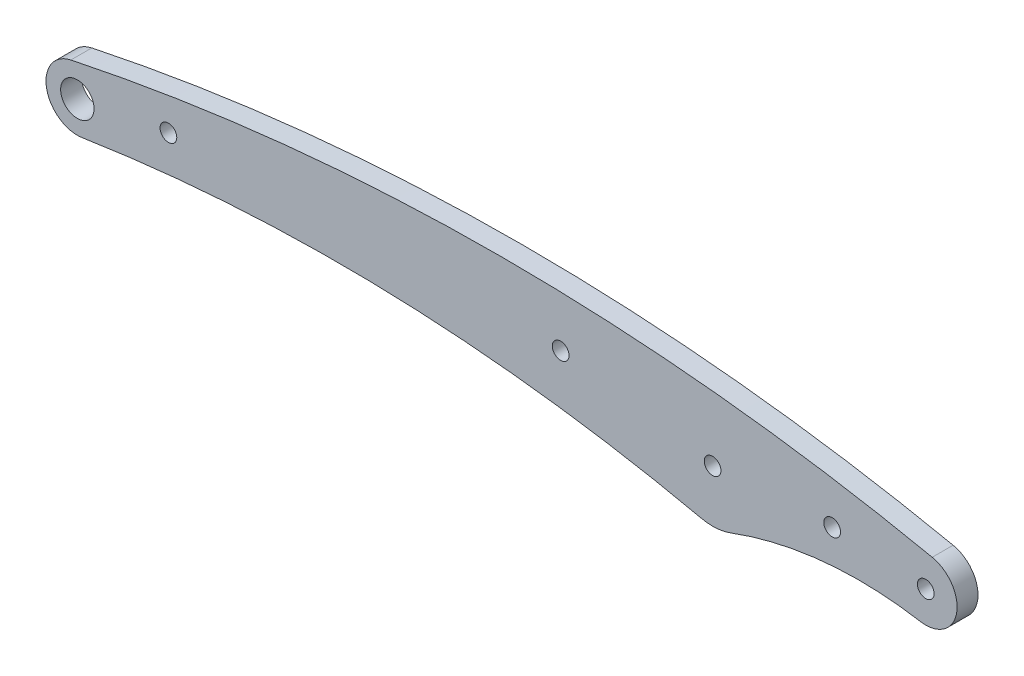
ISO-10303-21;
HEADER;
FILE_DESCRIPTION(('STEP AP214'),'2;1');
FILE_NAME('part.step','',(''),(''),'','','');
FILE_SCHEMA(('AUTOMOTIVE_DESIGN { 1 0 10303 214 1 1 1 1 }'));
ENDSEC;
DATA;
#1=APPLICATION_CONTEXT('core data for automotive mechanical design processes');
#2=APPLICATION_PROTOCOL_DEFINITION('international standard','automotive_design',2000,#1);
#3=PRODUCT_CONTEXT('',#1,'mechanical');
#4=PRODUCT('Part','Part','',(#3));
#5=PRODUCT_RELATED_PRODUCT_CATEGORY('part','',(#4));
#6=PRODUCT_DEFINITION_FORMATION('','',#4);
#7=PRODUCT_DEFINITION_CONTEXT('part definition',#1,'design');
#8=PRODUCT_DEFINITION('design','',#6,#7);
#9=PRODUCT_DEFINITION_SHAPE('','',#8);
#10=(LENGTH_UNIT() NAMED_UNIT(*) SI_UNIT(.MILLI.,.METRE.));
#11=(NAMED_UNIT(*) PLANE_ANGLE_UNIT() SI_UNIT($,.RADIAN.));
#12=(NAMED_UNIT(*) SI_UNIT($,.STERADIAN.) SOLID_ANGLE_UNIT());
#13=UNCERTAINTY_MEASURE_WITH_UNIT(LENGTH_MEASURE(1.E-05),#10,'distance_accuracy_value','');
#14=(GEOMETRIC_REPRESENTATION_CONTEXT(3) GLOBAL_UNCERTAINTY_ASSIGNED_CONTEXT((#13)) GLOBAL_UNIT_ASSIGNED_CONTEXT((#10,
#11,#12)) REPRESENTATION_CONTEXT('',''));
#15=CARTESIAN_POINT('',(0.,0.,0.));
#16=DIRECTION('',(0.,0.,1.));
#17=DIRECTION('',(1.,0.,0.));
#18=AXIS2_PLACEMENT_3D('',#15,#16,#17);
#19=CARTESIAN_POINT('',(31.2565789473684,-201.338244684181,5.));
#20=DIRECTION('',(0.,0.,1.));
#21=DIRECTION('',(1.,0.,0.));
#22=AXIS2_PLACEMENT_3D('',#19,#20,#21);
#23=PLANE('',#22);
#24=CARTESIAN_POINT('',(180.602574062331,1.58663817041305,5.));
#25=DIRECTION('',(0.,0.,1.));
#26=DIRECTION('',(1.,0.,0.));
#27=AXIS2_PLACEMENT_3D('',#24,#25,#26);
#28=CIRCLE('',#27,2.);
#29=CARTESIAN_POINT('',(182.602574062331,1.58663817041305,5.));
#30=VERTEX_POINT('',#29);
#31=EDGE_CURVE('E152',#30,#30,#28,.T.);
#32=ORIENTED_EDGE('',*,*,#31,.F.);
#33=EDGE_LOOP('',(#32));
#34=FACE_BOUND('',#33,.T.);
#35=CARTESIAN_POINT('',(115.643522850796,5.67392586663605,5.));
#36=DIRECTION('',(0.,0.,1.));
#37=DIRECTION('',(1.,0.,0.));
#38=AXIS2_PLACEMENT_3D('',#35,#36,#37);
#39=CIRCLE('',#38,2.);
#40=CARTESIAN_POINT('',(117.643522850796,5.67392586663605,5.));
#41=VERTEX_POINT('',#40);
#42=EDGE_CURVE('E142',#41,#41,#39,.T.);
#43=ORIENTED_EDGE('',*,*,#42,.F.);
#44=EDGE_LOOP('',(#43));
#45=FACE_BOUND('',#44,.T.);
#46=CARTESIAN_POINT('',(21.7926473493923,3.92392586663605,5.));
#47=DIRECTION('',(0.,0.,1.));
#48=DIRECTION('',(1.,0.,0.));
#49=AXIS2_PLACEMENT_3D('',#46,#47,#48);
#50=CIRCLE('',#49,2.);
#51=CARTESIAN_POINT('',(23.7926473493923,3.92392586663605,5.));
#52=VERTEX_POINT('',#51);
#53=EDGE_CURVE('E139',#52,#52,#50,.T.);
#54=ORIENTED_EDGE('',*,*,#53,.F.);
#55=EDGE_LOOP('',(#54));
#56=FACE_BOUND('',#55,.T.);
#57=CARTESIAN_POINT('',(203.,0.,5.));
#58=DIRECTION('',(0.,0.,1.));
#59=DIRECTION('',(1.,0.,0.));
#60=AXIS2_PLACEMENT_3D('',#57,#58,#59);
#61=CIRCLE('',#60,2.);
#62=CARTESIAN_POINT('',(205.,0.,5.));
#63=VERTEX_POINT('',#62);
#64=EDGE_CURVE('E161',#63,#63,#61,.T.);
#65=ORIENTED_EDGE('',*,*,#64,.F.);
#66=EDGE_LOOP('',(#65));
#67=FACE_BOUND('',#66,.T.);
#68=CARTESIAN_POINT('',(62.5131578947368,-402.676489368361,5.));
#69=DIRECTION('',(0.,0.,-1.));
#70=DIRECTION('',(1.,0.,0.));
#71=AXIS2_PLACEMENT_3D('',#68,#69,#70);
#72=CIRCLE('',#71,400.);
#73=CARTESIAN_POINT('',(1.15054891830804,-7.41122373070603,5.));
#74=VERTEX_POINT('',#73);
#75=CARTESIAN_POINT('',(149.288277511962,-12.2023178596473,5.));
#76=VERTEX_POINT('',#75);
#77=EDGE_CURVE('E130',#74,#76,#72,.T.);
#78=ORIENTED_EDGE('',*,*,#77,.T.);
#79=CARTESIAN_POINT('',(152.,0.,5.));
#80=DIRECTION('',(0.,0.,1.));
#81=DIRECTION('',(1.,0.,0.));
#82=AXIS2_PLACEMENT_3D('',#79,#80,#81);
#83=CIRCLE('',#82,12.5);
#84=CARTESIAN_POINT('',(156.381230513518,-11.7070414361367,5.));
#85=VERTEX_POINT('',#84);
#86=EDGE_CURVE('E88',#76,#85,#83,.T.);
#87=ORIENTED_EDGE('',*,*,#86,.T.);
#88=CARTESIAN_POINT('',(187.062310569417,-93.689642993309,5.));
#89=DIRECTION('',(0.,0.,-1.));
#90=DIRECTION('',(1.,0.,0.));
#91=AXIS2_PLACEMENT_3D('',#88,#89,#90);
#92=CIRCLE('',#91,87.5355678080549);
#93=CARTESIAN_POINT('',(201.742232266442,-7.39378254538363,5.));
#94=VERTEX_POINT('',#93);
#95=EDGE_CURVE('E101',#85,#94,#92,.T.);
#96=ORIENTED_EDGE('',*,*,#95,.T.);
#97=CARTESIAN_POINT('',(203.,0.,5.));
#98=DIRECTION('',(0.,0.,1.));
#99=DIRECTION('',(1.,0.,0.));
#100=AXIS2_PLACEMENT_3D('',#97,#98,#99);
#101=CIRCLE('',#100,7.50000000000001);
#102=CARTESIAN_POINT('',(204.545685279188,7.3389956409376,5.));
#103=VERTEX_POINT('',#102);
#104=EDGE_CURVE('E95',#94,#103,#101,.T.);
#105=ORIENTED_EDGE('',*,*,#104,.T.);
#106=CARTESIAN_POINT('',(101.5,-481.927380421574,5.));
#107=DIRECTION('',(0.,0.,1.));
#108=DIRECTION('',(1.,0.,0.));
#109=AXIS2_PLACEMENT_3D('',#106,#107,#108);
#110=CIRCLE('',#109,500.);
#111=CARTESIAN_POINT('',(-1.54568527918782,7.33899564093767,5.));
#112=VERTEX_POINT('',#111);
#113=EDGE_CURVE('E99',#103,#112,#110,.T.);
#114=ORIENTED_EDGE('',*,*,#113,.T.);
#115=CARTESIAN_POINT('',(0.,0.,5.));
#116=DIRECTION('',(0.,0.,1.));
#117=DIRECTION('',(1.,0.,0.));
#118=AXIS2_PLACEMENT_3D('',#115,#116,#117);
#119=CIRCLE('',#118,7.5);
#120=EDGE_CURVE('E51',#112,#74,#119,.T.);
#121=ORIENTED_EDGE('',*,*,#120,.T.);
#122=EDGE_LOOP('',(#78,#87,#96,#105,#114,#121));
#123=FACE_BOUND('',#122,.T.);
#124=CARTESIAN_POINT('',(0.,0.,5.));
#125=DIRECTION('',(0.,0.,1.));
#126=DIRECTION('',(1.,0.,0.));
#127=AXIS2_PLACEMENT_3D('',#124,#125,#126);
#128=CIRCLE('',#127,4.);
#129=CARTESIAN_POINT('',(4.,0.,5.));
#130=VERTEX_POINT('',#129);
#131=EDGE_CURVE('E123',#130,#130,#128,.T.);
#132=ORIENTED_EDGE('',*,*,#131,.F.);
#133=EDGE_LOOP('',(#132));
#134=FACE_BOUND('',#133,.T.);
#135=CARTESIAN_POINT('',(152.,0.,5.));
#136=DIRECTION('',(0.,0.,1.));
#137=DIRECTION('',(1.,0.,0.));
#138=AXIS2_PLACEMENT_3D('',#135,#136,#137);
#139=CIRCLE('',#138,2.);
#140=CARTESIAN_POINT('',(154.,0.,5.));
#141=VERTEX_POINT('',#140);
#142=EDGE_CURVE('E155',#141,#141,#139,.T.);
#143=ORIENTED_EDGE('',*,*,#142,.F.);
#144=EDGE_LOOP('',(#143));
#145=FACE_BOUND('',#144,.T.);
#146=ADVANCED_FACE('F32',(#34,#45,#56,#67,#123,#134,#145),#23,.T.);
#147=CARTESIAN_POINT('',(31.2565789473684,-201.338244684181,0.));
#148=DIRECTION('',(0.,0.,1.));
#149=DIRECTION('',(1.,0.,0.));
#150=AXIS2_PLACEMENT_3D('',#147,#148,#149);
#151=PLANE('',#150);
#152=CARTESIAN_POINT('',(180.602574062331,1.58663817041305,0.));
#153=DIRECTION('',(0.,0.,1.));
#154=DIRECTION('',(1.,0.,0.));
#155=AXIS2_PLACEMENT_3D('',#152,#153,#154);
#156=CIRCLE('',#155,2.);
#157=CARTESIAN_POINT('',(182.602574062331,1.58663817041305,0.));
#158=VERTEX_POINT('',#157);
#159=EDGE_CURVE('E36',#158,#158,#156,.T.);
#160=ORIENTED_EDGE('',*,*,#159,.T.);
#161=EDGE_LOOP('',(#160));
#162=FACE_BOUND('',#161,.T.);
#163=CARTESIAN_POINT('',(115.643522850796,5.67392586663605,0.));
#164=DIRECTION('',(0.,0.,1.));
#165=DIRECTION('',(1.,0.,0.));
#166=AXIS2_PLACEMENT_3D('',#163,#164,#165);
#167=CIRCLE('',#166,2.);
#168=CARTESIAN_POINT('',(117.643522850796,5.67392586663605,0.));
#169=VERTEX_POINT('',#168);
#170=EDGE_CURVE('E140',#169,#169,#167,.T.);
#171=ORIENTED_EDGE('',*,*,#170,.T.);
#172=EDGE_LOOP('',(#171));
#173=FACE_BOUND('',#172,.T.);
#174=CARTESIAN_POINT('',(21.7926473493923,3.92392586663605,0.));
#175=DIRECTION('',(0.,0.,1.));
#176=DIRECTION('',(1.,0.,0.));
#177=AXIS2_PLACEMENT_3D('',#174,#175,#176);
#178=CIRCLE('',#177,2.);
#179=CARTESIAN_POINT('',(23.7926473493923,3.92392586663605,0.));
#180=VERTEX_POINT('',#179);
#181=EDGE_CURVE('E136',#180,#180,#178,.T.);
#182=ORIENTED_EDGE('',*,*,#181,.T.);
#183=EDGE_LOOP('',(#182));
#184=FACE_BOUND('',#183,.T.);
#185=CARTESIAN_POINT('',(203.,0.,0.));
#186=DIRECTION('',(0.,0.,1.));
#187=DIRECTION('',(1.,0.,0.));
#188=AXIS2_PLACEMENT_3D('',#185,#186,#187);
#189=CIRCLE('',#188,2.);
#190=CARTESIAN_POINT('',(205.,0.,0.));
#191=VERTEX_POINT('',#190);
#192=EDGE_CURVE('E158',#191,#191,#189,.T.);
#193=ORIENTED_EDGE('',*,*,#192,.T.);
#194=EDGE_LOOP('',(#193));
#195=FACE_BOUND('',#194,.T.);
#196=CARTESIAN_POINT('',(62.5131578947368,-402.676489368361,0.));
#197=DIRECTION('',(0.,0.,-1.));
#198=DIRECTION('',(1.,0.,0.));
#199=AXIS2_PLACEMENT_3D('',#196,#197,#198);
#200=CIRCLE('',#199,400.);
#201=CARTESIAN_POINT('',(1.15054891830804,-7.41122373070603,0.));
#202=VERTEX_POINT('',#201);
#203=CARTESIAN_POINT('',(149.288277511962,-12.2023178596473,0.));
#204=VERTEX_POINT('',#203);
#205=EDGE_CURVE('E119',#202,#204,#200,.T.);
#206=ORIENTED_EDGE('',*,*,#205,.F.);
#207=CARTESIAN_POINT('',(0.,0.,0.));
#208=DIRECTION('',(0.,0.,1.));
#209=DIRECTION('',(1.,0.,0.));
#210=AXIS2_PLACEMENT_3D('',#207,#208,#209);
#211=CIRCLE('',#210,7.5);
#212=CARTESIAN_POINT('',(-1.54568527918782,7.33899564093767,0.));
#213=VERTEX_POINT('',#212);
#214=EDGE_CURVE('E80',#213,#202,#211,.T.);
#215=ORIENTED_EDGE('',*,*,#214,.F.);
#216=CARTESIAN_POINT('',(101.5,-481.927380421574,0.));
#217=DIRECTION('',(0.,0.,1.));
#218=DIRECTION('',(1.,0.,0.));
#219=AXIS2_PLACEMENT_3D('',#216,#217,#218);
#220=CIRCLE('',#219,500.);
#221=CARTESIAN_POINT('',(204.545685279188,7.3389956409376,0.));
#222=VERTEX_POINT('',#221);
#223=EDGE_CURVE('E74',#222,#213,#220,.T.);
#224=ORIENTED_EDGE('',*,*,#223,.F.);
#225=CARTESIAN_POINT('',(203.,0.,0.));
#226=DIRECTION('',(0.,0.,1.));
#227=DIRECTION('',(1.,0.,0.));
#228=AXIS2_PLACEMENT_3D('',#225,#226,#227);
#229=CIRCLE('',#228,7.50000000000001);
#230=CARTESIAN_POINT('',(201.742232266442,-7.39378254538363,0.));
#231=VERTEX_POINT('',#230);
#232=EDGE_CURVE('E109',#231,#222,#229,.T.);
#233=ORIENTED_EDGE('',*,*,#232,.F.);
#234=CARTESIAN_POINT('',(187.062310569417,-93.689642993309,0.));
#235=DIRECTION('',(0.,0.,-1.));
#236=DIRECTION('',(1.,0.,0.));
#237=AXIS2_PLACEMENT_3D('',#234,#235,#236);
#238=CIRCLE('',#237,87.5355678080549);
#239=CARTESIAN_POINT('',(156.381230513518,-11.7070414361367,0.));
#240=VERTEX_POINT('',#239);
#241=EDGE_CURVE('E125',#240,#231,#238,.T.);
#242=ORIENTED_EDGE('',*,*,#241,.F.);
#243=CARTESIAN_POINT('',(152.,0.,0.));
#244=DIRECTION('',(0.,0.,1.));
#245=DIRECTION('',(1.,0.,0.));
#246=AXIS2_PLACEMENT_3D('',#243,#244,#245);
#247=CIRCLE('',#246,12.5);
#248=EDGE_CURVE('E122',#204,#240,#247,.T.);
#249=ORIENTED_EDGE('',*,*,#248,.F.);
#250=EDGE_LOOP('',(#206,#215,#224,#233,#242,#249));
#251=FACE_BOUND('',#250,.T.);
#252=CARTESIAN_POINT('',(0.,0.,0.));
#253=DIRECTION('',(0.,0.,1.));
#254=DIRECTION('',(1.,0.,0.));
#255=AXIS2_PLACEMENT_3D('',#252,#253,#254);
#256=CIRCLE('',#255,4.);
#257=CARTESIAN_POINT('',(4.,0.,0.));
#258=VERTEX_POINT('',#257);
#259=EDGE_CURVE('E164',#258,#258,#256,.T.);
#260=ORIENTED_EDGE('',*,*,#259,.T.);
#261=EDGE_LOOP('',(#260));
#262=FACE_BOUND('',#261,.T.);
#263=CARTESIAN_POINT('',(152.,0.,0.));
#264=DIRECTION('',(0.,0.,1.));
#265=DIRECTION('',(1.,0.,0.));
#266=AXIS2_PLACEMENT_3D('',#263,#264,#265);
#267=CIRCLE('',#266,2.);
#268=CARTESIAN_POINT('',(154.,0.,0.));
#269=VERTEX_POINT('',#268);
#270=EDGE_CURVE('E138',#269,#269,#267,.T.);
#271=ORIENTED_EDGE('',*,*,#270,.T.);
#272=EDGE_LOOP('',(#271));
#273=FACE_BOUND('',#272,.T.);
#274=ADVANCED_FACE('F180',(#162,#173,#184,#195,#251,#262,#273),#151,.F.);
#275=CARTESIAN_POINT('',(62.5131578947368,-402.676489368361,5.));
#276=DIRECTION('',(0.,0.,-1.));
#277=DIRECTION('',(-1.,0.,0.));
#278=AXIS2_PLACEMENT_3D('',#275,#276,#277);
#279=CYLINDRICAL_SURFACE('',#278,400.);
#280=ORIENTED_EDGE('',*,*,#205,.T.);
#281=DIRECTION('',(0.,0.,-1.));
#282=VECTOR('',#281,1.);
#283=CARTESIAN_POINT('',(149.288277511962,-12.2023178596473,5.));
#284=LINE('',#283,#282);
#285=EDGE_CURVE('E11',#76,#204,#284,.T.);
#286=ORIENTED_EDGE('',*,*,#285,.F.);
#287=ORIENTED_EDGE('',*,*,#77,.F.);
#288=DIRECTION('',(0.,0.,-1.));
#289=VECTOR('',#288,1.);
#290=CARTESIAN_POINT('',(1.15054891830804,-7.41122373070603,5.));
#291=LINE('',#290,#289);
#292=EDGE_CURVE('E115',#74,#202,#291,.T.);
#293=ORIENTED_EDGE('',*,*,#292,.T.);
#294=EDGE_LOOP('',(#280,#286,#287,#293));
#295=FACE_BOUND('',#294,.T.);
#296=ADVANCED_FACE('F34',(#295),#279,.F.);
#297=CARTESIAN_POINT('',(152.,0.,5.));
#298=DIRECTION('',(0.,0.,-1.));
#299=DIRECTION('',(-1.,0.,0.));
#300=AXIS2_PLACEMENT_3D('',#297,#298,#299);
#301=CYLINDRICAL_SURFACE('',#300,12.5);
#302=ORIENTED_EDGE('',*,*,#248,.T.);
#303=DIRECTION('',(0.,0.,-1.));
#304=VECTOR('',#303,1.);
#305=CARTESIAN_POINT('',(156.381230513518,-11.7070414361367,5.));
#306=LINE('',#305,#304);
#307=EDGE_CURVE('E42',#85,#240,#306,.T.);
#308=ORIENTED_EDGE('',*,*,#307,.F.);
#309=ORIENTED_EDGE('',*,*,#86,.F.);
#310=ORIENTED_EDGE('',*,*,#285,.T.);
#311=EDGE_LOOP('',(#302,#308,#309,#310));
#312=FACE_BOUND('',#311,.T.);
#313=ADVANCED_FACE('F174',(#312),#301,.T.);
#314=CARTESIAN_POINT('',(187.062310569417,-93.689642993309,5.));
#315=DIRECTION('',(0.,0.,-1.));
#316=DIRECTION('',(-1.,0.,0.));
#317=AXIS2_PLACEMENT_3D('',#314,#315,#316);
#318=CYLINDRICAL_SURFACE('',#317,87.5355678080549);
#319=ORIENTED_EDGE('',*,*,#241,.T.);
#320=DIRECTION('',(0.,0.,-1.));
#321=VECTOR('',#320,1.);
#322=CARTESIAN_POINT('',(201.742232266442,-7.39378254538363,5.));
#323=LINE('',#322,#321);
#324=EDGE_CURVE('E110',#94,#231,#323,.T.);
#325=ORIENTED_EDGE('',*,*,#324,.F.);
#326=ORIENTED_EDGE('',*,*,#95,.F.);
#327=ORIENTED_EDGE('',*,*,#307,.T.);
#328=EDGE_LOOP('',(#319,#325,#326,#327));
#329=FACE_BOUND('',#328,.T.);
#330=ADVANCED_FACE('F177',(#329),#318,.F.);
#331=CARTESIAN_POINT('',(203.,0.,5.));
#332=DIRECTION('',(0.,0.,-1.));
#333=DIRECTION('',(-1.,0.,0.));
#334=AXIS2_PLACEMENT_3D('',#331,#332,#333);
#335=CYLINDRICAL_SURFACE('',#334,7.50000000000001);
#336=ORIENTED_EDGE('',*,*,#232,.T.);
#337=DIRECTION('',(0.,0.,-1.));
#338=VECTOR('',#337,1.);
#339=CARTESIAN_POINT('',(204.545685279188,7.3389956409376,5.));
#340=LINE('',#339,#338);
#341=EDGE_CURVE('E106',#103,#222,#340,.T.);
#342=ORIENTED_EDGE('',*,*,#341,.F.);
#343=ORIENTED_EDGE('',*,*,#104,.F.);
#344=ORIENTED_EDGE('',*,*,#324,.T.);
#345=EDGE_LOOP('',(#336,#342,#343,#344));
#346=FACE_BOUND('',#345,.T.);
#347=ADVANCED_FACE('F107',(#346),#335,.T.);
#348=CARTESIAN_POINT('',(101.5,-481.927380421574,5.));
#349=DIRECTION('',(0.,0.,-1.));
#350=DIRECTION('',(-1.,0.,0.));
#351=AXIS2_PLACEMENT_3D('',#348,#349,#350);
#352=CYLINDRICAL_SURFACE('',#351,500.);
#353=ORIENTED_EDGE('',*,*,#223,.T.);
#354=DIRECTION('',(0.,0.,-1.));
#355=VECTOR('',#354,1.);
#356=CARTESIAN_POINT('',(-1.54568527918782,7.33899564093767,5.));
#357=LINE('',#356,#355);
#358=EDGE_CURVE('E111',#112,#213,#357,.T.);
#359=ORIENTED_EDGE('',*,*,#358,.F.);
#360=ORIENTED_EDGE('',*,*,#113,.F.);
#361=ORIENTED_EDGE('',*,*,#341,.T.);
#362=EDGE_LOOP('',(#353,#359,#360,#361));
#363=FACE_BOUND('',#362,.T.);
#364=ADVANCED_FACE('F113',(#363),#352,.T.);
#365=CARTESIAN_POINT('',(0.,0.,5.));
#366=DIRECTION('',(0.,0.,-1.));
#367=DIRECTION('',(-1.,0.,0.));
#368=AXIS2_PLACEMENT_3D('',#365,#366,#367);
#369=CYLINDRICAL_SURFACE('',#368,7.5);
#370=ORIENTED_EDGE('',*,*,#214,.T.);
#371=ORIENTED_EDGE('',*,*,#292,.F.);
#372=ORIENTED_EDGE('',*,*,#120,.F.);
#373=ORIENTED_EDGE('',*,*,#358,.T.);
#374=EDGE_LOOP('',(#370,#371,#372,#373));
#375=FACE_BOUND('',#374,.T.);
#376=ADVANCED_FACE('F183',(#375),#369,.T.);
#377=CARTESIAN_POINT('',(0.,0.,5.));
#378=DIRECTION('',(0.,0.,-1.));
#379=DIRECTION('',(-1.,0.,0.));
#380=AXIS2_PLACEMENT_3D('',#377,#378,#379);
#381=CYLINDRICAL_SURFACE('',#380,4.);
#382=ORIENTED_EDGE('',*,*,#131,.T.);
#383=EDGE_LOOP('',(#382));
#384=FACE_BOUND('',#383,.T.);
#385=ORIENTED_EDGE('',*,*,#259,.F.);
#386=EDGE_LOOP('',(#385));
#387=FACE_BOUND('',#386,.T.);
#388=ADVANCED_FACE('F185',(#384,#387),#381,.F.);
#389=CARTESIAN_POINT('',(203.,0.,5.));
#390=DIRECTION('',(0.,0.,-1.));
#391=DIRECTION('',(-1.,0.,0.));
#392=AXIS2_PLACEMENT_3D('',#389,#390,#391);
#393=CYLINDRICAL_SURFACE('',#392,2.);
#394=ORIENTED_EDGE('',*,*,#64,.T.);
#395=EDGE_LOOP('',(#394));
#396=FACE_BOUND('',#395,.T.);
#397=ORIENTED_EDGE('',*,*,#192,.F.);
#398=EDGE_LOOP('',(#397));
#399=FACE_BOUND('',#398,.T.);
#400=ADVANCED_FACE('F191',(#396,#399),#393,.F.);
#401=CARTESIAN_POINT('',(152.,0.,5.));
#402=DIRECTION('',(0.,0.,-1.));
#403=DIRECTION('',(-1.,0.,0.));
#404=AXIS2_PLACEMENT_3D('',#401,#402,#403);
#405=CYLINDRICAL_SURFACE('',#404,2.);
#406=ORIENTED_EDGE('',*,*,#142,.T.);
#407=EDGE_LOOP('',(#406));
#408=FACE_BOUND('',#407,.T.);
#409=ORIENTED_EDGE('',*,*,#270,.F.);
#410=EDGE_LOOP('',(#409));
#411=FACE_BOUND('',#410,.T.);
#412=ADVANCED_FACE('F208',(#408,#411),#405,.F.);
#413=CARTESIAN_POINT('',(21.7926473493923,3.92392586663605,-5.));
#414=DIRECTION('',(0.,0.,1.));
#415=DIRECTION('',(1.,0.,0.));
#416=AXIS2_PLACEMENT_3D('',#413,#414,#415);
#417=CYLINDRICAL_SURFACE('',#416,2.);
#418=ORIENTED_EDGE('',*,*,#53,.T.);
#419=EDGE_LOOP('',(#418));
#420=FACE_BOUND('',#419,.T.);
#421=ORIENTED_EDGE('',*,*,#181,.F.);
#422=EDGE_LOOP('',(#421));
#423=FACE_BOUND('',#422,.T.);
#424=ADVANCED_FACE('F212',(#420,#423),#417,.F.);
#425=CARTESIAN_POINT('',(115.643522850796,5.67392586663605,-5.));
#426=DIRECTION('',(0.,0.,1.));
#427=DIRECTION('',(1.,0.,0.));
#428=AXIS2_PLACEMENT_3D('',#425,#426,#427);
#429=CYLINDRICAL_SURFACE('',#428,2.);
#430=ORIENTED_EDGE('',*,*,#42,.T.);
#431=EDGE_LOOP('',(#430));
#432=FACE_BOUND('',#431,.T.);
#433=ORIENTED_EDGE('',*,*,#170,.F.);
#434=EDGE_LOOP('',(#433));
#435=FACE_BOUND('',#434,.T.);
#436=ADVANCED_FACE('F216',(#432,#435),#429,.F.);
#437=CARTESIAN_POINT('',(180.602574062331,1.58663817041305,-5.));
#438=DIRECTION('',(0.,0.,1.));
#439=DIRECTION('',(1.,0.,0.));
#440=AXIS2_PLACEMENT_3D('',#437,#438,#439);
#441=CYLINDRICAL_SURFACE('',#440,2.);
#442=ORIENTED_EDGE('',*,*,#31,.T.);
#443=EDGE_LOOP('',(#442));
#444=FACE_BOUND('',#443,.T.);
#445=ORIENTED_EDGE('',*,*,#159,.F.);
#446=EDGE_LOOP('',(#445));
#447=FACE_BOUND('',#446,.T.);
#448=ADVANCED_FACE('F220',(#444,#447),#441,.F.);
#449=CLOSED_SHELL('',(#146,#274,#296,#313,#330,#347,#364,#376,#388,#400,#412,#424,#436,#448));
#450=MANIFOLD_SOLID_BREP('B2',#449);
#451=ADVANCED_BREP_SHAPE_REPRESENTATION('',(#18,#450),#14);
#452=SHAPE_DEFINITION_REPRESENTATION(#9,#451);
ENDSEC;
END-ISO-10303-21;
